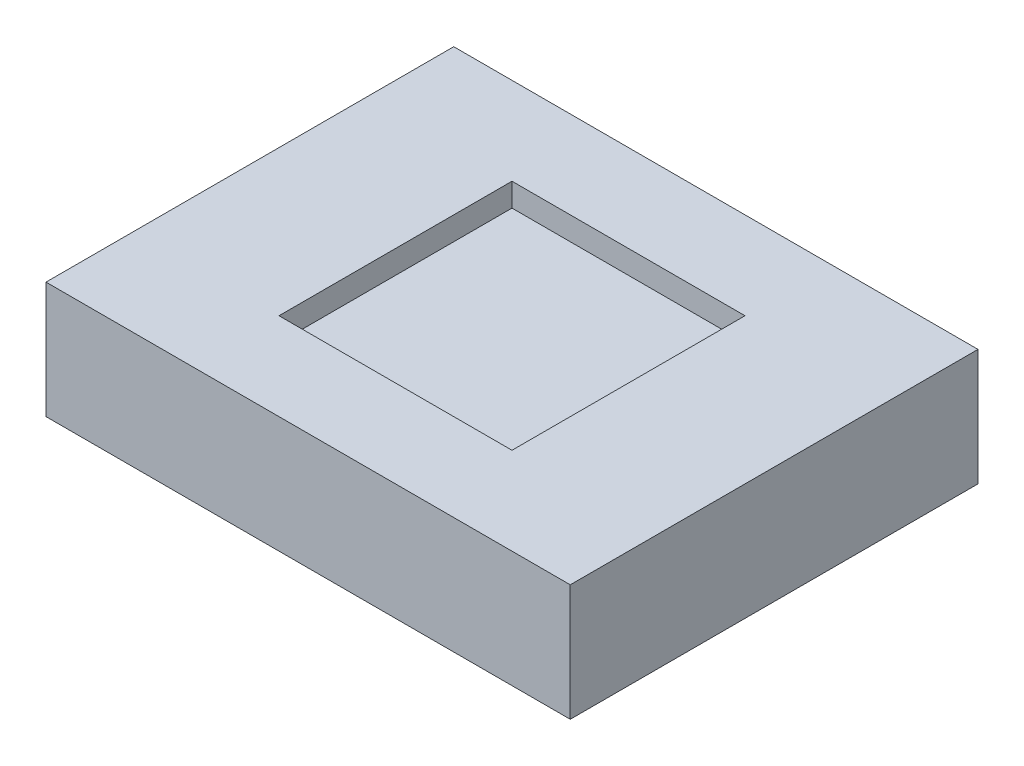
ISO-10303-21;
HEADER;
FILE_DESCRIPTION(('STEP AP214'),'2;1');
FILE_NAME('part.step','',(''),(''),'','','');
FILE_SCHEMA(('AUTOMOTIVE_DESIGN { 1 0 10303 214 1 1 1 1 }'));
ENDSEC;
DATA;
#1=APPLICATION_CONTEXT('core data for automotive mechanical design processes');
#2=APPLICATION_PROTOCOL_DEFINITION('international standard','automotive_design',2000,#1);
#3=PRODUCT_CONTEXT('',#1,'mechanical');
#4=PRODUCT('Part','Part','',(#3));
#5=PRODUCT_RELATED_PRODUCT_CATEGORY('part','',(#4));
#6=PRODUCT_DEFINITION_FORMATION('','',#4);
#7=PRODUCT_DEFINITION_CONTEXT('part definition',#1,'design');
#8=PRODUCT_DEFINITION('design','',#6,#7);
#9=PRODUCT_DEFINITION_SHAPE('','',#8);
#10=(LENGTH_UNIT() NAMED_UNIT(*) SI_UNIT(.MILLI.,.METRE.));
#11=(NAMED_UNIT(*) PLANE_ANGLE_UNIT() SI_UNIT($,.RADIAN.));
#12=(NAMED_UNIT(*) SI_UNIT($,.STERADIAN.) SOLID_ANGLE_UNIT());
#13=UNCERTAINTY_MEASURE_WITH_UNIT(LENGTH_MEASURE(1.E-05),#10,'distance_accuracy_value','');
#14=(GEOMETRIC_REPRESENTATION_CONTEXT(3) GLOBAL_UNCERTAINTY_ASSIGNED_CONTEXT((#13)) GLOBAL_UNIT_ASSIGNED_CONTEXT((#10,
#11,#12)) REPRESENTATION_CONTEXT('',''));
#15=CARTESIAN_POINT('',(0.,0.,0.));
#16=DIRECTION('',(0.,0.,1.));
#17=DIRECTION('',(1.,0.,0.));
#18=AXIS2_PLACEMENT_3D('',#15,#16,#17);
#19=CARTESIAN_POINT('',(22.4999999999984,9.99999999999994,-17.4999999999996));
#20=DIRECTION('',(-0.999999999999961,0.,0.));
#21=DIRECTION('',(0.,0.,1.));
#22=AXIS2_PLACEMENT_3D('',#19,#20,#21);
#23=PLANE('',#22);
#24=DIRECTION('',(0.,0.,-1.));
#25=VECTOR('',#24,1.);
#26=CARTESIAN_POINT('',(22.4999999999982,0.,-17.5));
#27=LINE('',#26,#25);
#28=CARTESIAN_POINT('',(22.4999999999989,1.6306400674182E-13,17.5));
#29=VERTEX_POINT('',#28);
#30=CARTESIAN_POINT('',(22.4999999999982,0.,-17.5));
#31=VERTEX_POINT('',#30);
#32=EDGE_CURVE('E472',#29,#31,#27,.T.);
#33=ORIENTED_EDGE('',*,*,#32,.T.);
#34=DIRECTION('',(0.,-1.,0.));
#35=VECTOR('',#34,1.);
#36=CARTESIAN_POINT('',(22.4999999999984,9.99999999999994,-17.4999999999996));
#37=LINE('',#36,#35);
#38=CARTESIAN_POINT('',(22.4999999999984,9.99999999999994,-17.4999999999996));
#39=VERTEX_POINT('',#38);
#40=EDGE_CURVE('E12',#39,#31,#37,.T.);
#41=ORIENTED_EDGE('',*,*,#40,.F.);
#42=DIRECTION('',(0.,0.,-1.));
#43=VECTOR('',#42,1.);
#44=CARTESIAN_POINT('',(22.4999999999984,9.99999999999994,-17.4999999999996));
#45=LINE('',#44,#43);
#46=CARTESIAN_POINT('',(22.4999999999999,10.0000000000001,17.5));
#47=VERTEX_POINT('',#46);
#48=EDGE_CURVE('E476',#47,#39,#45,.T.);
#49=ORIENTED_EDGE('',*,*,#48,.F.);
#50=DIRECTION('',(0.,-1.,0.));
#51=VECTOR('',#50,1.);
#52=CARTESIAN_POINT('',(22.4999999999999,10.0000000000001,17.5));
#53=LINE('',#52,#51);
#54=EDGE_CURVE('E488',#47,#29,#53,.T.);
#55=ORIENTED_EDGE('',*,*,#54,.T.);
#56=EDGE_LOOP('',(#33,#41,#49,#55));
#57=FACE_BOUND('',#56,.T.);
#58=ADVANCED_FACE('F350',(#57),#23,.F.);
#59=CARTESIAN_POINT('',(-22.5,10.,-17.5000000000004));
#60=DIRECTION('',(0.,0.,1.));
#61=DIRECTION('',(0.999999999999961,0.,0.));
#62=AXIS2_PLACEMENT_3D('',#59,#60,#61);
#63=PLANE('',#62);
#64=DIRECTION('',(-0.999999999999961,0.,0.));
#65=VECTOR('',#64,1.);
#66=CARTESIAN_POINT('',(-22.5,0.,-17.5000000000004));
#67=LINE('',#66,#65);
#68=CARTESIAN_POINT('',(-22.5,0.,-17.5000000000004));
#69=VERTEX_POINT('',#68);
#70=EDGE_CURVE('E495',#31,#69,#67,.T.);
#71=ORIENTED_EDGE('',*,*,#70,.T.);
#72=DIRECTION('',(0.,-1.,0.));
#73=VECTOR('',#72,1.);
#74=CARTESIAN_POINT('',(-22.5,10.,-17.5000000000004));
#75=LINE('',#74,#73);
#76=CARTESIAN_POINT('',(-22.5,10.,-17.5000000000004));
#77=VERTEX_POINT('',#76);
#78=EDGE_CURVE('E355',#77,#69,#75,.T.);
#79=ORIENTED_EDGE('',*,*,#78,.F.);
#80=DIRECTION('',(-0.999999999999961,0.,0.));
#81=VECTOR('',#80,1.);
#82=CARTESIAN_POINT('',(-22.5,10.,-17.5000000000004));
#83=LINE('',#82,#81);
#84=EDGE_CURVE('E397',#39,#77,#83,.T.);
#85=ORIENTED_EDGE('',*,*,#84,.F.);
#86=ORIENTED_EDGE('',*,*,#40,.T.);
#87=EDGE_LOOP('',(#71,#79,#85,#86));
#88=FACE_BOUND('',#87,.T.);
#89=ADVANCED_FACE('F526',(#88),#63,.F.);
#90=CARTESIAN_POINT('',(-22.5,10.,-17.5000000000004));
#91=DIRECTION('',(0.999999999999961,0.,0.));
#92=DIRECTION('',(0.,0.,-1.));
#93=AXIS2_PLACEMENT_3D('',#90,#91,#92);
#94=PLANE('',#93);
#95=DIRECTION('',(0.,0.,1.));
#96=VECTOR('',#95,1.);
#97=CARTESIAN_POINT('',(-22.5,0.,-17.5000000000004));
#98=LINE('',#97,#96);
#99=CARTESIAN_POINT('',(-22.4999999999991,3.50414142147315E-13,17.4999999999992));
#100=VERTEX_POINT('',#99);
#101=EDGE_CURVE('E494',#69,#100,#98,.T.);
#102=ORIENTED_EDGE('',*,*,#101,.T.);
#103=DIRECTION('',(0.,-1.,0.));
#104=VECTOR('',#103,1.);
#105=CARTESIAN_POINT('',(-22.4999999999992,10.0000000000008,17.5));
#106=LINE('',#105,#104);
#107=CARTESIAN_POINT('',(-22.4999999999992,10.0000000000008,17.5));
#108=VERTEX_POINT('',#107);
#109=EDGE_CURVE('E502',#108,#100,#106,.T.);
#110=ORIENTED_EDGE('',*,*,#109,.F.);
#111=DIRECTION('',(0.,0.,1.));
#112=VECTOR('',#111,1.);
#113=CARTESIAN_POINT('',(-22.5,10.,-17.5000000000004));
#114=LINE('',#113,#112);
#115=EDGE_CURVE('E483',#77,#108,#114,.T.);
#116=ORIENTED_EDGE('',*,*,#115,.F.);
#117=ORIENTED_EDGE('',*,*,#78,.T.);
#118=EDGE_LOOP('',(#102,#110,#116,#117));
#119=FACE_BOUND('',#118,.T.);
#120=ADVANCED_FACE('F512',(#119),#94,.F.);
#121=CARTESIAN_POINT('',(-22.4999999999992,10.0000000000008,17.5));
#122=DIRECTION('',(0.,0.,-1.));
#123=DIRECTION('',(-0.999999999999961,0.,0.));
#124=AXIS2_PLACEMENT_3D('',#121,#122,#123);
#125=PLANE('',#124);
#126=DIRECTION('',(0.999999999999961,0.,0.));
#127=VECTOR('',#126,1.);
#128=CARTESIAN_POINT('',(-22.4999999999991,3.50414142147315E-13,17.4999999999992));
#129=LINE('',#128,#127);
#130=EDGE_CURVE('E392',#100,#29,#129,.T.);
#131=ORIENTED_EDGE('',*,*,#130,.T.);
#132=ORIENTED_EDGE('',*,*,#54,.F.);
#133=DIRECTION('',(0.999999999999961,0.,0.));
#134=VECTOR('',#133,1.);
#135=CARTESIAN_POINT('',(-22.4999999999992,10.0000000000008,17.5));
#136=LINE('',#135,#134);
#137=EDGE_CURVE('E371',#108,#47,#136,.T.);
#138=ORIENTED_EDGE('',*,*,#137,.F.);
#139=ORIENTED_EDGE('',*,*,#109,.T.);
#140=EDGE_LOOP('',(#131,#132,#138,#139));
#141=FACE_BOUND('',#140,.T.);
#142=ADVANCED_FACE('F518',(#141),#125,.F.);
#143=CARTESIAN_POINT('',(-5.93275428784068E-13,10.0000000000006,0.));
#144=DIRECTION('',(0.,1.,0.));
#145=DIRECTION('',(0.,0.,1.));
#146=AXIS2_PLACEMENT_3D('',#143,#144,#145);
#147=PLANE('',#146);
#148=DIRECTION('',(0.999999999999961,0.,0.));
#149=VECTOR('',#148,1.);
#150=CARTESIAN_POINT('',(-10.,10.,10.));
#151=LINE('',#150,#149);
#152=CARTESIAN_POINT('',(-10.,10.,10.));
#153=VERTEX_POINT('',#152);
#154=CARTESIAN_POINT('',(9.99999999999949,10.0000000000005,10.));
#155=VERTEX_POINT('',#154);
#156=EDGE_CURVE('E362',#153,#155,#151,.T.);
#157=ORIENTED_EDGE('',*,*,#156,.F.);
#158=DIRECTION('',(0.,0.,1.));
#159=VECTOR('',#158,1.);
#160=CARTESIAN_POINT('',(-10.,10.,-9.99999999999999));
#161=LINE('',#160,#159);
#162=CARTESIAN_POINT('',(-10.,10.,-9.99999999999999));
#163=VERTEX_POINT('',#162);
#164=EDGE_CURVE('E441',#163,#153,#161,.T.);
#165=ORIENTED_EDGE('',*,*,#164,.F.);
#166=DIRECTION('',(0.999999999999961,0.,0.));
#167=VECTOR('',#166,1.);
#168=CARTESIAN_POINT('',(-10.,10.,-9.99999999999999));
#169=LINE('',#168,#167);
#170=CARTESIAN_POINT('',(9.99999999999909,10.0000000000002,-9.99999999999999));
#171=VERTEX_POINT('',#170);
#172=EDGE_CURVE('E450',#163,#171,#169,.T.);
#173=ORIENTED_EDGE('',*,*,#172,.T.);
#174=DIRECTION('',(0.,0.,1.));
#175=VECTOR('',#174,1.);
#176=CARTESIAN_POINT('',(9.99999999999909,10.0000000000002,-9.99999999999999));
#177=LINE('',#176,#175);
#178=EDGE_CURVE('E462',#171,#155,#177,.T.);
#179=ORIENTED_EDGE('',*,*,#178,.T.);
#180=EDGE_LOOP('',(#157,#165,#173,#179));
#181=FACE_BOUND('',#180,.T.);
#182=ORIENTED_EDGE('',*,*,#48,.T.);
#183=ORIENTED_EDGE('',*,*,#84,.T.);
#184=ORIENTED_EDGE('',*,*,#115,.T.);
#185=ORIENTED_EDGE('',*,*,#137,.T.);
#186=EDGE_LOOP('',(#182,#183,#184,#185));
#187=FACE_BOUND('',#186,.T.);
#188=ADVANCED_FACE('F521',(#181,#187),#147,.T.);
#189=CARTESIAN_POINT('',(0.,0.,0.));
#190=DIRECTION('',(0.,1.,0.));
#191=DIRECTION('',(0.,0.,1.));
#192=AXIS2_PLACEMENT_3D('',#189,#190,#191);
#193=PLANE('',#192);
#194=CARTESIAN_POINT('',(18.7543919793085,0.,13.75));
#195=DIRECTION('',(0.,-1.,0.));
#196=DIRECTION('',(0.,0.,-1.));
#197=AXIS2_PLACEMENT_3D('',#194,#195,#196);
#198=CIRCLE('',#197,2.85);
#199=CARTESIAN_POINT('',(18.7543919793084,0.,10.9));
#200=VERTEX_POINT('',#199);
#201=EDGE_CURVE('E672',#200,#200,#198,.T.);
#202=ORIENTED_EDGE('',*,*,#201,.F.);
#203=EDGE_LOOP('',(#202));
#204=FACE_BOUND('',#203,.T.);
#205=CARTESIAN_POINT('',(-18.7499999999997,0.,-13.7500000000004));
#206=DIRECTION('',(0.,-1.,0.));
#207=DIRECTION('',(0.,0.,-1.));
#208=AXIS2_PLACEMENT_3D('',#205,#206,#207);
#209=CIRCLE('',#208,2.85);
#210=CARTESIAN_POINT('',(-18.7499999999997,0.,-16.6000000000004));
#211=VERTEX_POINT('',#210);
#212=EDGE_CURVE('E674',#211,#211,#209,.T.);
#213=ORIENTED_EDGE('',*,*,#212,.F.);
#214=EDGE_LOOP('',(#213));
#215=FACE_BOUND('',#214,.T.);
#216=CARTESIAN_POINT('',(18.7543919793077,5.72458747072346E-13,-13.75));
#217=DIRECTION('',(0.,-1.,0.));
#218=DIRECTION('',(0.,0.,-1.));
#219=AXIS2_PLACEMENT_3D('',#216,#217,#218);
#220=CIRCLE('',#219,2.85);
#221=CARTESIAN_POINT('',(18.7543919793077,5.70136309248262E-13,-16.6));
#222=VERTEX_POINT('',#221);
#223=EDGE_CURVE('E689',#222,#222,#220,.T.);
#224=ORIENTED_EDGE('',*,*,#223,.F.);
#225=EDGE_LOOP('',(#224));
#226=FACE_BOUND('',#225,.T.);
#227=CARTESIAN_POINT('',(-18.7499999999998,1.07552855510562E-13,13.75));
#228=DIRECTION('',(0.,-1.,0.));
#229=DIRECTION('',(0.,0.,-1.));
#230=AXIS2_PLACEMENT_3D('',#227,#228,#229);
#231=CIRCLE('',#230,2.85);
#232=CARTESIAN_POINT('',(-18.7499999999999,1.05230417686478E-13,10.9));
#233=VERTEX_POINT('',#232);
#234=EDGE_CURVE('E453',#233,#233,#231,.T.);
#235=ORIENTED_EDGE('',*,*,#234,.F.);
#236=EDGE_LOOP('',(#235));
#237=FACE_BOUND('',#236,.T.);
#238=ORIENTED_EDGE('',*,*,#32,.F.);
#239=ORIENTED_EDGE('',*,*,#130,.F.);
#240=ORIENTED_EDGE('',*,*,#101,.F.);
#241=ORIENTED_EDGE('',*,*,#70,.F.);
#242=EDGE_LOOP('',(#238,#239,#240,#241));
#243=FACE_BOUND('',#242,.T.);
#244=ADVANCED_FACE('F513',(#204,#215,#226,#237,#243),#193,.F.);
#245=CARTESIAN_POINT('',(-10.,8.,10.));
#246=DIRECTION('',(0.,0.,1.));
#247=DIRECTION('',(0.999999999999961,0.,0.));
#248=AXIS2_PLACEMENT_3D('',#245,#246,#247);
#249=PLANE('',#248);
#250=ORIENTED_EDGE('',*,*,#156,.T.);
#251=DIRECTION('',(0.,1.,0.));
#252=VECTOR('',#251,1.);
#253=CARTESIAN_POINT('',(9.9999999999995,8.00000000000043,10.));
#254=LINE('',#253,#252);
#255=CARTESIAN_POINT('',(9.9999999999995,8.00000000000043,10.));
#256=VERTEX_POINT('',#255);
#257=EDGE_CURVE('E422',#256,#155,#254,.T.);
#258=ORIENTED_EDGE('',*,*,#257,.F.);
#259=DIRECTION('',(0.999999999999961,0.,0.));
#260=VECTOR('',#259,1.);
#261=CARTESIAN_POINT('',(-10.,8.,10.));
#262=LINE('',#261,#260);
#263=CARTESIAN_POINT('',(-10.,8.,10.));
#264=VERTEX_POINT('',#263);
#265=EDGE_CURVE('E433',#264,#256,#262,.T.);
#266=ORIENTED_EDGE('',*,*,#265,.F.);
#267=DIRECTION('',(0.,1.,0.));
#268=VECTOR('',#267,1.);
#269=CARTESIAN_POINT('',(-10.,8.,10.));
#270=LINE('',#269,#268);
#271=EDGE_CURVE('E467',#264,#153,#270,.T.);
#272=ORIENTED_EDGE('',*,*,#271,.T.);
#273=EDGE_LOOP('',(#250,#258,#266,#272));
#274=FACE_BOUND('',#273,.T.);
#275=ADVANCED_FACE('F436',(#274),#249,.F.);
#276=CARTESIAN_POINT('',(-10.,8.00000000000001,-9.99999999999999));
#277=DIRECTION('',(-0.999999999999961,0.,0.));
#278=DIRECTION('',(0.,0.,1.));
#279=AXIS2_PLACEMENT_3D('',#276,#277,#278);
#280=PLANE('',#279);
#281=ORIENTED_EDGE('',*,*,#164,.T.);
#282=ORIENTED_EDGE('',*,*,#271,.F.);
#283=DIRECTION('',(0.,0.,1.));
#284=VECTOR('',#283,1.);
#285=CARTESIAN_POINT('',(-10.,8.00000000000001,-9.99999999999999));
#286=LINE('',#285,#284);
#287=CARTESIAN_POINT('',(-10.,8.00000000000001,-9.99999999999999));
#288=VERTEX_POINT('',#287);
#289=EDGE_CURVE('E438',#288,#264,#286,.T.);
#290=ORIENTED_EDGE('',*,*,#289,.F.);
#291=DIRECTION('',(0.,1.,0.));
#292=VECTOR('',#291,1.);
#293=CARTESIAN_POINT('',(-10.,8.00000000000001,-9.99999999999999));
#294=LINE('',#293,#292);
#295=EDGE_CURVE('E471',#288,#163,#294,.T.);
#296=ORIENTED_EDGE('',*,*,#295,.T.);
#297=EDGE_LOOP('',(#281,#282,#290,#296));
#298=FACE_BOUND('',#297,.T.);
#299=ADVANCED_FACE('F564',(#298),#280,.F.);
#300=CARTESIAN_POINT('',(-10.,8.00000000000001,-9.99999999999999));
#301=DIRECTION('',(0.,0.,1.));
#302=DIRECTION('',(0.999999999999961,0.,0.));
#303=AXIS2_PLACEMENT_3D('',#300,#301,#302);
#304=PLANE('',#303);
#305=ORIENTED_EDGE('',*,*,#172,.F.);
#306=ORIENTED_EDGE('',*,*,#295,.F.);
#307=DIRECTION('',(0.999999999999961,0.,0.));
#308=VECTOR('',#307,1.);
#309=CARTESIAN_POINT('',(-10.,8.00000000000001,-9.99999999999999));
#310=LINE('',#309,#308);
#311=CARTESIAN_POINT('',(9.99999999999935,8.00000000000059,-9.99999999999999));
#312=VERTEX_POINT('',#311);
#313=EDGE_CURVE('E435',#288,#312,#310,.T.);
#314=ORIENTED_EDGE('',*,*,#313,.T.);
#315=DIRECTION('',(0.,1.,0.));
#316=VECTOR('',#315,1.);
#317=CARTESIAN_POINT('',(9.99999999999935,8.00000000000059,-9.99999999999999));
#318=LINE('',#317,#316);
#319=EDGE_CURVE('E430',#312,#171,#318,.T.);
#320=ORIENTED_EDGE('',*,*,#319,.T.);
#321=EDGE_LOOP('',(#305,#306,#314,#320));
#322=FACE_BOUND('',#321,.T.);
#323=ADVANCED_FACE('F574',(#322),#304,.T.);
#324=CARTESIAN_POINT('',(9.99999999999935,8.00000000000059,-9.99999999999999));
#325=DIRECTION('',(-0.999999999999961,0.,0.));
#326=DIRECTION('',(0.,0.,1.));
#327=AXIS2_PLACEMENT_3D('',#324,#325,#326);
#328=PLANE('',#327);
#329=ORIENTED_EDGE('',*,*,#178,.F.);
#330=ORIENTED_EDGE('',*,*,#319,.F.);
#331=DIRECTION('',(0.,0.,1.));
#332=VECTOR('',#331,1.);
#333=CARTESIAN_POINT('',(9.99999999999935,8.00000000000059,-9.99999999999999));
#334=LINE('',#333,#332);
#335=EDGE_CURVE('E425',#312,#256,#334,.T.);
#336=ORIENTED_EDGE('',*,*,#335,.T.);
#337=ORIENTED_EDGE('',*,*,#257,.T.);
#338=EDGE_LOOP('',(#329,#330,#336,#337));
#339=FACE_BOUND('',#338,.T.);
#340=ADVANCED_FACE('F424',(#339),#328,.T.);
#341=CARTESIAN_POINT('',(-4.19803081186387E-13,8.00000000000041,0.));
#342=DIRECTION('',(0.,-1.,0.));
#343=DIRECTION('',(0.,0.,-1.));
#344=AXIS2_PLACEMENT_3D('',#341,#342,#343);
#345=PLANE('',#344);
#346=ORIENTED_EDGE('',*,*,#265,.T.);
#347=ORIENTED_EDGE('',*,*,#335,.F.);
#348=ORIENTED_EDGE('',*,*,#313,.F.);
#349=ORIENTED_EDGE('',*,*,#289,.T.);
#350=EDGE_LOOP('',(#346,#347,#348,#349));
#351=FACE_BOUND('',#350,.T.);
#352=ADVANCED_FACE('F442',(#351),#345,.F.);
#353=CARTESIAN_POINT('',(-18.7499999999995,7.00000000000046,13.75));
#354=DIRECTION('',(0.,-1.,0.));
#355=DIRECTION('',(0.,0.,-1.));
#356=AXIS2_PLACEMENT_3D('',#353,#354,#355);
#357=CYLINDRICAL_SURFACE('',#356,2.85);
#358=CARTESIAN_POINT('',(-18.7499999999995,7.00000000000046,13.75));
#359=DIRECTION('',(0.,-1.,0.));
#360=DIRECTION('',(0.,0.,-1.));
#361=AXIS2_PLACEMENT_3D('',#358,#359,#360);
#362=CIRCLE('',#361,2.85);
#363=CARTESIAN_POINT('',(-18.7499999999996,7.00000000000046,10.9));
#364=VERTEX_POINT('',#363);
#365=EDGE_CURVE('E464',#364,#364,#362,.T.);
#366=ORIENTED_EDGE('',*,*,#365,.F.);
#367=EDGE_LOOP('',(#366));
#368=FACE_BOUND('',#367,.T.);
#369=ORIENTED_EDGE('',*,*,#234,.T.);
#370=EDGE_LOOP('',(#369));
#371=FACE_BOUND('',#370,.T.);
#372=ADVANCED_FACE('F600',(#368,#371),#357,.F.);
#373=CARTESIAN_POINT('',(-18.7499999999995,7.00000000000046,13.75));
#374=DIRECTION('',(0.,-1.,0.));
#375=DIRECTION('',(0.,0.,-1.));
#376=AXIS2_PLACEMENT_3D('',#373,#374,#375);
#377=PLANE('',#376);
#378=ORIENTED_EDGE('',*,*,#365,.T.);
#379=EDGE_LOOP('',(#378));
#380=FACE_BOUND('',#379,.T.);
#381=ADVANCED_FACE('F604',(#380),#377,.T.);
#382=CARTESIAN_POINT('',(18.7543919793072,7.00000000000003,-13.75));
#383=DIRECTION('',(0.,-1.,0.));
#384=DIRECTION('',(0.,0.,-1.));
#385=AXIS2_PLACEMENT_3D('',#382,#383,#384);
#386=CYLINDRICAL_SURFACE('',#385,2.85);
#387=CARTESIAN_POINT('',(18.7543919793072,7.00000000000003,-13.75));
#388=DIRECTION('',(0.,-1.,0.));
#389=DIRECTION('',(0.,0.,-1.));
#390=AXIS2_PLACEMENT_3D('',#387,#388,#389);
#391=CIRCLE('',#390,2.85);
#392=CARTESIAN_POINT('',(18.7543919793072,7.00000000000003,-16.6));
#393=VERTEX_POINT('',#392);
#394=EDGE_CURVE('E712',#393,#393,#391,.T.);
#395=ORIENTED_EDGE('',*,*,#394,.F.);
#396=EDGE_LOOP('',(#395));
#397=FACE_BOUND('',#396,.T.);
#398=ORIENTED_EDGE('',*,*,#223,.T.);
#399=EDGE_LOOP('',(#398));
#400=FACE_BOUND('',#399,.T.);
#401=ADVANCED_FACE('F613',(#397,#400),#386,.F.);
#402=CARTESIAN_POINT('',(18.7543919793072,7.00000000000003,-13.75));
#403=DIRECTION('',(0.,-1.,0.));
#404=DIRECTION('',(0.,0.,-1.));
#405=AXIS2_PLACEMENT_3D('',#402,#403,#404);
#406=PLANE('',#405);
#407=ORIENTED_EDGE('',*,*,#394,.T.);
#408=EDGE_LOOP('',(#407));
#409=FACE_BOUND('',#408,.T.);
#410=ADVANCED_FACE('F621',(#409),#406,.T.);
#411=CARTESIAN_POINT('',(-18.7499999999997,7.00000000000001,-13.7500000000004));
#412=DIRECTION('',(0.,-1.,0.));
#413=DIRECTION('',(0.,0.,-1.));
#414=AXIS2_PLACEMENT_3D('',#411,#412,#413);
#415=CYLINDRICAL_SURFACE('',#414,2.85);
#416=CARTESIAN_POINT('',(-18.7499999999997,7.00000000000001,-13.7500000000004));
#417=DIRECTION('',(0.,-1.,0.));
#418=DIRECTION('',(0.,0.,-1.));
#419=AXIS2_PLACEMENT_3D('',#416,#417,#418);
#420=CIRCLE('',#419,2.85);
#421=CARTESIAN_POINT('',(-18.7499999999997,7.00000000000001,-16.6000000000004));
#422=VERTEX_POINT('',#421);
#423=EDGE_CURVE('E683',#422,#422,#420,.T.);
#424=ORIENTED_EDGE('',*,*,#423,.F.);
#425=EDGE_LOOP('',(#424));
#426=FACE_BOUND('',#425,.T.);
#427=ORIENTED_EDGE('',*,*,#212,.T.);
#428=EDGE_LOOP('',(#427));
#429=FACE_BOUND('',#428,.T.);
#430=ADVANCED_FACE('F635',(#426,#429),#415,.F.);
#431=CARTESIAN_POINT('',(-18.7499999999997,7.00000000000001,-13.7500000000004));
#432=DIRECTION('',(0.,-1.,0.));
#433=DIRECTION('',(0.,0.,-1.));
#434=AXIS2_PLACEMENT_3D('',#431,#432,#433);
#435=PLANE('',#434);
#436=ORIENTED_EDGE('',*,*,#423,.T.);
#437=EDGE_LOOP('',(#436));
#438=FACE_BOUND('',#437,.T.);
#439=ADVANCED_FACE('F643',(#438),#435,.T.);
#440=CARTESIAN_POINT('',(18.754391979308,7.00000000000034,13.75));
#441=DIRECTION('',(0.,-1.,0.));
#442=DIRECTION('',(0.,0.,-1.));
#443=AXIS2_PLACEMENT_3D('',#440,#441,#442);
#444=CYLINDRICAL_SURFACE('',#443,2.85);
#445=CARTESIAN_POINT('',(18.754391979308,7.00000000000034,13.75));
#446=DIRECTION('',(0.,-1.,0.));
#447=DIRECTION('',(0.,0.,-1.));
#448=AXIS2_PLACEMENT_3D('',#445,#446,#447);
#449=CIRCLE('',#448,2.85);
#450=CARTESIAN_POINT('',(18.754391979308,7.00000000000033,10.9));
#451=VERTEX_POINT('',#450);
#452=EDGE_CURVE('E675',#451,#451,#449,.T.);
#453=ORIENTED_EDGE('',*,*,#452,.F.);
#454=EDGE_LOOP('',(#453));
#455=FACE_BOUND('',#454,.T.);
#456=ORIENTED_EDGE('',*,*,#201,.T.);
#457=EDGE_LOOP('',(#456));
#458=FACE_BOUND('',#457,.T.);
#459=ADVANCED_FACE('F649',(#455,#458),#444,.F.);
#460=CARTESIAN_POINT('',(18.754391979308,7.00000000000034,13.75));
#461=DIRECTION('',(0.,-1.,0.));
#462=DIRECTION('',(0.,0.,-1.));
#463=AXIS2_PLACEMENT_3D('',#460,#461,#462);
#464=PLANE('',#463);
#465=ORIENTED_EDGE('',*,*,#452,.T.);
#466=EDGE_LOOP('',(#465));
#467=FACE_BOUND('',#466,.T.);
#468=ADVANCED_FACE('F658',(#467),#464,.T.);
#469=CLOSED_SHELL('',(#58,#89,#120,#142,#188,#244,#275,#299,#323,#340,#352,#372,#381,#401,#410,
#430,#439,#459,#468));
#470=MANIFOLD_SOLID_BREP('B2',#469);
#471=ADVANCED_BREP_SHAPE_REPRESENTATION('',(#18,#470),#14);
#472=SHAPE_DEFINITION_REPRESENTATION(#9,#471);
ENDSEC;
END-ISO-10303-21;
